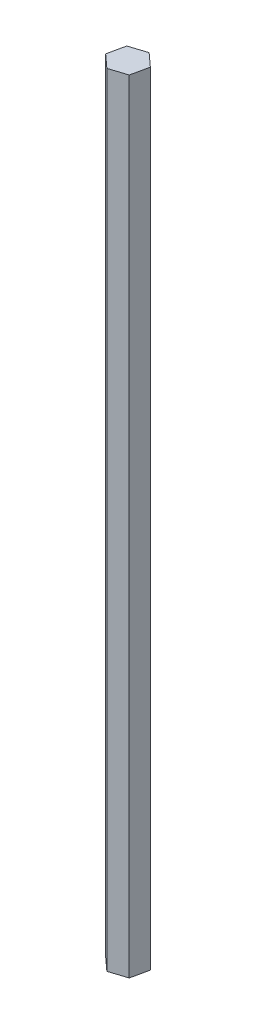
ISO-10303-21;
HEADER;
FILE_DESCRIPTION(('STEP AP214'),'2;1');
FILE_NAME('part.step','',(''),(''),'','','');
FILE_SCHEMA(('AUTOMOTIVE_DESIGN { 1 0 10303 214 1 1 1 1 }'));
ENDSEC;
DATA;
#1=APPLICATION_CONTEXT('core data for automotive mechanical design processes');
#2=APPLICATION_PROTOCOL_DEFINITION('international standard','automotive_design',2000,#1);
#3=PRODUCT_CONTEXT('',#1,'mechanical');
#4=PRODUCT('Part','Part','',(#3));
#5=PRODUCT_RELATED_PRODUCT_CATEGORY('part','',(#4));
#6=PRODUCT_DEFINITION_FORMATION('','',#4);
#7=PRODUCT_DEFINITION_CONTEXT('part definition',#1,'design');
#8=PRODUCT_DEFINITION('design','',#6,#7);
#9=PRODUCT_DEFINITION_SHAPE('','',#8);
#10=(LENGTH_UNIT() NAMED_UNIT(*) SI_UNIT(.MILLI.,.METRE.));
#11=(NAMED_UNIT(*) PLANE_ANGLE_UNIT() SI_UNIT($,.RADIAN.));
#12=(NAMED_UNIT(*) SI_UNIT($,.STERADIAN.) SOLID_ANGLE_UNIT());
#13=UNCERTAINTY_MEASURE_WITH_UNIT(LENGTH_MEASURE(1.E-05),#10,'distance_accuracy_value','');
#14=(GEOMETRIC_REPRESENTATION_CONTEXT(3) GLOBAL_UNCERTAINTY_ASSIGNED_CONTEXT((#13)) GLOBAL_UNIT_ASSIGNED_CONTEXT((#10,
#11,#12)) REPRESENTATION_CONTEXT('',''));
#15=CARTESIAN_POINT('',(0.,0.,0.));
#16=DIRECTION('',(0.,0.,1.));
#17=DIRECTION('',(1.,0.,0.));
#18=AXIS2_PLACEMENT_3D('',#15,#16,#17);
#19=CARTESIAN_POINT('',(-0.61182187926995,127.,2.82117126764399));
#20=DIRECTION('',(-0.305094633460301,0.,-0.952322038300976));
#21=DIRECTION('',(-0.952322038300976,0.,0.305094633460301));
#22=AXIS2_PLACEMENT_3D('',#19,#20,#21);
#23=PLANE('',#22);
#24=DIRECTION('',(0.952322038300976,0.,-0.305094633460301));
#25=VECTOR('',#24,1.);
#26=CARTESIAN_POINT('',(-0.61182187926995,0.,2.82117126764399));
#27=LINE('',#26,#25);
#28=CARTESIAN_POINT('',(-0.61182187926995,0.,2.82117126764399));
#29=VERTEX_POINT('',#28);
#30=CARTESIAN_POINT('',(2.13729504657146,0.,1.94043892386091));
#31=VERTEX_POINT('',#30);
#32=EDGE_CURVE('E117',#29,#31,#27,.T.);
#33=ORIENTED_EDGE('',*,*,#32,.T.);
#34=DIRECTION('',(0.,-1.,0.));
#35=VECTOR('',#34,1.);
#36=CARTESIAN_POINT('',(2.13729504657146,127.,1.94043892386091));
#37=LINE('',#36,#35);
#38=CARTESIAN_POINT('',(2.13729504657146,127.,1.94043892386091));
#39=VERTEX_POINT('',#38);
#40=EDGE_CURVE('E11',#39,#31,#37,.T.);
#41=ORIENTED_EDGE('',*,*,#40,.F.);
#42=DIRECTION('',(0.952322038300976,0.,-0.305094633460301));
#43=VECTOR('',#42,1.);
#44=CARTESIAN_POINT('',(-0.61182187926995,127.,2.82117126764399));
#45=LINE('',#44,#43);
#46=CARTESIAN_POINT('',(-0.61182187926995,127.,2.82117126764399));
#47=VERTEX_POINT('',#46);
#48=EDGE_CURVE('E127',#47,#39,#45,.T.);
#49=ORIENTED_EDGE('',*,*,#48,.F.);
#50=DIRECTION('',(0.,-1.,0.));
#51=VECTOR('',#50,1.);
#52=CARTESIAN_POINT('',(-0.61182187926995,127.,2.82117126764399));
#53=LINE('',#52,#51);
#54=EDGE_CURVE('E113',#47,#29,#53,.T.);
#55=ORIENTED_EDGE('',*,*,#54,.T.);
#56=EDGE_LOOP('',(#33,#41,#49,#55));
#57=FACE_BOUND('',#56,.T.);
#58=ADVANCED_FACE('F33',(#57),#23,.F.);
#59=CARTESIAN_POINT('',(2.13729504657146,127.,1.94043892386091));
#60=DIRECTION('',(-0.977282394482572,0.,-0.211941316015566));
#61=DIRECTION('',(-0.211941316015566,0.,0.977282394482572));
#62=AXIS2_PLACEMENT_3D('',#59,#60,#61);
#63=PLANE('',#62);
#64=DIRECTION('',(0.211941316015566,0.,-0.977282394482572));
#65=VECTOR('',#64,1.);
#66=CARTESIAN_POINT('',(2.13729504657146,0.,1.94043892386091));
#67=LINE('',#66,#65);
#68=CARTESIAN_POINT('',(2.74911692584142,0.,-0.880732343783076));
#69=VERTEX_POINT('',#68);
#70=EDGE_CURVE('E120',#31,#69,#67,.T.);
#71=ORIENTED_EDGE('',*,*,#70,.T.);
#72=DIRECTION('',(0.,-1.,0.));
#73=VECTOR('',#72,1.);
#74=CARTESIAN_POINT('',(2.74911692584142,127.,-0.880732343783076));
#75=LINE('',#74,#73);
#76=CARTESIAN_POINT('',(2.74911692584142,127.,-0.880732343783076));
#77=VERTEX_POINT('',#76);
#78=EDGE_CURVE('E41',#77,#69,#75,.T.);
#79=ORIENTED_EDGE('',*,*,#78,.F.);
#80=DIRECTION('',(0.211941316015566,0.,-0.977282394482572));
#81=VECTOR('',#80,1.);
#82=CARTESIAN_POINT('',(2.13729504657146,127.,1.94043892386091));
#83=LINE('',#82,#81);
#84=EDGE_CURVE('E86',#39,#77,#83,.T.);
#85=ORIENTED_EDGE('',*,*,#84,.F.);
#86=ORIENTED_EDGE('',*,*,#40,.T.);
#87=EDGE_LOOP('',(#71,#79,#85,#86));
#88=FACE_BOUND('',#87,.T.);
#89=ADVANCED_FACE('F151',(#88),#63,.F.);
#90=CARTESIAN_POINT('',(2.74911692584142,127.,-0.880732343783076));
#91=DIRECTION('',(-0.672187761022271,0.,0.74038072228541));
#92=DIRECTION('',(0.74038072228541,0.,0.672187761022271));
#93=AXIS2_PLACEMENT_3D('',#90,#91,#92);
#94=PLANE('',#93);
#95=DIRECTION('',(-0.74038072228541,0.,-0.672187761022271));
#96=VECTOR('',#95,1.);
#97=CARTESIAN_POINT('',(2.74911692584142,0.,-0.880732343783076));
#98=LINE('',#97,#96);
#99=CARTESIAN_POINT('',(0.611821879269952,0.,-2.82117126764399));
#100=VERTEX_POINT('',#99);
#101=EDGE_CURVE('E122',#69,#100,#98,.T.);
#102=ORIENTED_EDGE('',*,*,#101,.T.);
#103=DIRECTION('',(0.,-1.,0.));
#104=VECTOR('',#103,1.);
#105=CARTESIAN_POINT('',(0.611821879269952,127.,-2.82117126764399));
#106=LINE('',#105,#104);
#107=CARTESIAN_POINT('',(0.611821879269952,127.,-2.82117126764399));
#108=VERTEX_POINT('',#107);
#109=EDGE_CURVE('E108',#108,#100,#106,.T.);
#110=ORIENTED_EDGE('',*,*,#109,.F.);
#111=DIRECTION('',(-0.74038072228541,0.,-0.672187761022271));
#112=VECTOR('',#111,1.);
#113=CARTESIAN_POINT('',(2.74911692584142,127.,-0.880732343783076));
#114=LINE('',#113,#112);
#115=EDGE_CURVE('E99',#77,#108,#114,.T.);
#116=ORIENTED_EDGE('',*,*,#115,.F.);
#117=ORIENTED_EDGE('',*,*,#78,.T.);
#118=EDGE_LOOP('',(#102,#110,#116,#117));
#119=FACE_BOUND('',#118,.T.);
#120=ADVANCED_FACE('F133',(#119),#94,.F.);
#121=CARTESIAN_POINT('',(0.611821879269952,127.,-2.82117126764399));
#122=DIRECTION('',(0.305094633460301,0.,0.952322038300975));
#123=DIRECTION('',(0.952322038300976,0.,-0.305094633460301));
#124=AXIS2_PLACEMENT_3D('',#121,#122,#123);
#125=PLANE('',#124);
#126=DIRECTION('',(-0.952322038300976,0.,0.305094633460301));
#127=VECTOR('',#126,1.);
#128=CARTESIAN_POINT('',(0.611821879269952,0.,-2.82117126764399));
#129=LINE('',#128,#127);
#130=CARTESIAN_POINT('',(-2.13729504657146,0.,-1.94043892386091));
#131=VERTEX_POINT('',#130);
#132=EDGE_CURVE('E107',#100,#131,#129,.T.);
#133=ORIENTED_EDGE('',*,*,#132,.T.);
#134=DIRECTION('',(0.,-1.,0.));
#135=VECTOR('',#134,1.);
#136=CARTESIAN_POINT('',(-2.13729504657146,127.,-1.94043892386091));
#137=LINE('',#136,#135);
#138=CARTESIAN_POINT('',(-2.13729504657146,127.,-1.94043892386091));
#139=VERTEX_POINT('',#138);
#140=EDGE_CURVE('E104',#139,#131,#137,.T.);
#141=ORIENTED_EDGE('',*,*,#140,.F.);
#142=DIRECTION('',(-0.952322038300976,0.,0.305094633460301));
#143=VECTOR('',#142,1.);
#144=CARTESIAN_POINT('',(0.611821879269952,127.,-2.82117126764399));
#145=LINE('',#144,#143);
#146=EDGE_CURVE('E93',#108,#139,#145,.T.);
#147=ORIENTED_EDGE('',*,*,#146,.F.);
#148=ORIENTED_EDGE('',*,*,#109,.T.);
#149=EDGE_LOOP('',(#133,#141,#147,#148));
#150=FACE_BOUND('',#149,.T.);
#151=ADVANCED_FACE('F105',(#150),#125,.F.);
#152=CARTESIAN_POINT('',(-2.13729504657146,127.,-1.94043892386091));
#153=DIRECTION('',(0.977282394482573,0.,0.211941316015565));
#154=DIRECTION('',(0.211941316015565,0.,-0.977282394482573));
#155=AXIS2_PLACEMENT_3D('',#152,#153,#154);
#156=PLANE('',#155);
#157=DIRECTION('',(-0.211941316015565,0.,0.977282394482572));
#158=VECTOR('',#157,1.);
#159=CARTESIAN_POINT('',(-2.13729504657146,0.,-1.94043892386091));
#160=LINE('',#159,#158);
#161=CARTESIAN_POINT('',(-2.74911692584141,0.,0.88073234378308));
#162=VERTEX_POINT('',#161);
#163=EDGE_CURVE('E72',#131,#162,#160,.T.);
#164=ORIENTED_EDGE('',*,*,#163,.T.);
#165=DIRECTION('',(0.,-1.,0.));
#166=VECTOR('',#165,1.);
#167=CARTESIAN_POINT('',(-2.74911692584141,127.,0.88073234378308));
#168=LINE('',#167,#166);
#169=CARTESIAN_POINT('',(-2.74911692584141,127.,0.88073234378308));
#170=VERTEX_POINT('',#169);
#171=EDGE_CURVE('E109',#170,#162,#168,.T.);
#172=ORIENTED_EDGE('',*,*,#171,.F.);
#173=DIRECTION('',(-0.211941316015565,0.,0.977282394482572));
#174=VECTOR('',#173,1.);
#175=CARTESIAN_POINT('',(-2.13729504657146,127.,-1.94043892386091));
#176=LINE('',#175,#174);
#177=EDGE_CURVE('E97',#139,#170,#176,.T.);
#178=ORIENTED_EDGE('',*,*,#177,.F.);
#179=ORIENTED_EDGE('',*,*,#140,.T.);
#180=EDGE_LOOP('',(#164,#172,#178,#179));
#181=FACE_BOUND('',#180,.T.);
#182=ADVANCED_FACE('F111',(#181),#156,.F.);
#183=CARTESIAN_POINT('',(-2.74911692584141,127.,0.88073234378308));
#184=DIRECTION('',(0.672187761022271,0.,-0.74038072228541));
#185=DIRECTION('',(-0.740380722285411,0.,-0.672187761022271));
#186=AXIS2_PLACEMENT_3D('',#183,#184,#185);
#187=PLANE('',#186);
#188=DIRECTION('',(0.740380722285411,0.,0.672187761022271));
#189=VECTOR('',#188,1.);
#190=CARTESIAN_POINT('',(-2.74911692584141,0.,0.88073234378308));
#191=LINE('',#190,#189);
#192=EDGE_CURVE('E78',#162,#29,#191,.T.);
#193=ORIENTED_EDGE('',*,*,#192,.T.);
#194=ORIENTED_EDGE('',*,*,#54,.F.);
#195=DIRECTION('',(0.740380722285411,0.,0.672187761022271));
#196=VECTOR('',#195,1.);
#197=CARTESIAN_POINT('',(-2.74911692584141,127.,0.88073234378308));
#198=LINE('',#197,#196);
#199=EDGE_CURVE('E49',#170,#47,#198,.T.);
#200=ORIENTED_EDGE('',*,*,#199,.F.);
#201=ORIENTED_EDGE('',*,*,#171,.T.);
#202=EDGE_LOOP('',(#193,#194,#200,#201));
#203=FACE_BOUND('',#202,.T.);
#204=ADVANCED_FACE('F140',(#203),#187,.F.);
#205=CARTESIAN_POINT('',(0.,127.,0.));
#206=DIRECTION('',(0.,1.,0.));
#207=DIRECTION('',(0.,0.,1.));
#208=AXIS2_PLACEMENT_3D('',#205,#206,#207);
#209=PLANE('',#208);
#210=ORIENTED_EDGE('',*,*,#48,.T.);
#211=ORIENTED_EDGE('',*,*,#84,.T.);
#212=ORIENTED_EDGE('',*,*,#115,.T.);
#213=ORIENTED_EDGE('',*,*,#146,.T.);
#214=ORIENTED_EDGE('',*,*,#177,.T.);
#215=ORIENTED_EDGE('',*,*,#199,.T.);
#216=EDGE_LOOP('',(#210,#211,#212,#213,#214,#215));
#217=FACE_BOUND('',#216,.T.);
#218=ADVANCED_FACE('F95',(#217),#209,.T.);
#219=CARTESIAN_POINT('',(0.,0.,0.));
#220=DIRECTION('',(0.,1.,0.));
#221=DIRECTION('',(0.,0.,1.));
#222=AXIS2_PLACEMENT_3D('',#219,#220,#221);
#223=PLANE('',#222);
#224=ORIENTED_EDGE('',*,*,#32,.F.);
#225=ORIENTED_EDGE('',*,*,#192,.F.);
#226=ORIENTED_EDGE('',*,*,#163,.F.);
#227=ORIENTED_EDGE('',*,*,#132,.F.);
#228=ORIENTED_EDGE('',*,*,#101,.F.);
#229=ORIENTED_EDGE('',*,*,#70,.F.);
#230=EDGE_LOOP('',(#224,#225,#226,#227,#228,#229));
#231=FACE_BOUND('',#230,.T.);
#232=ADVANCED_FACE('F136',(#231),#223,.F.);
#233=CLOSED_SHELL('',(#58,#89,#120,#151,#182,#204,#218,#232));
#234=MANIFOLD_SOLID_BREP('B2',#233);
#235=ADVANCED_BREP_SHAPE_REPRESENTATION('',(#18,#234),#14);
#236=SHAPE_DEFINITION_REPRESENTATION(#9,#235);
ENDSEC;
END-ISO-10303-21;
